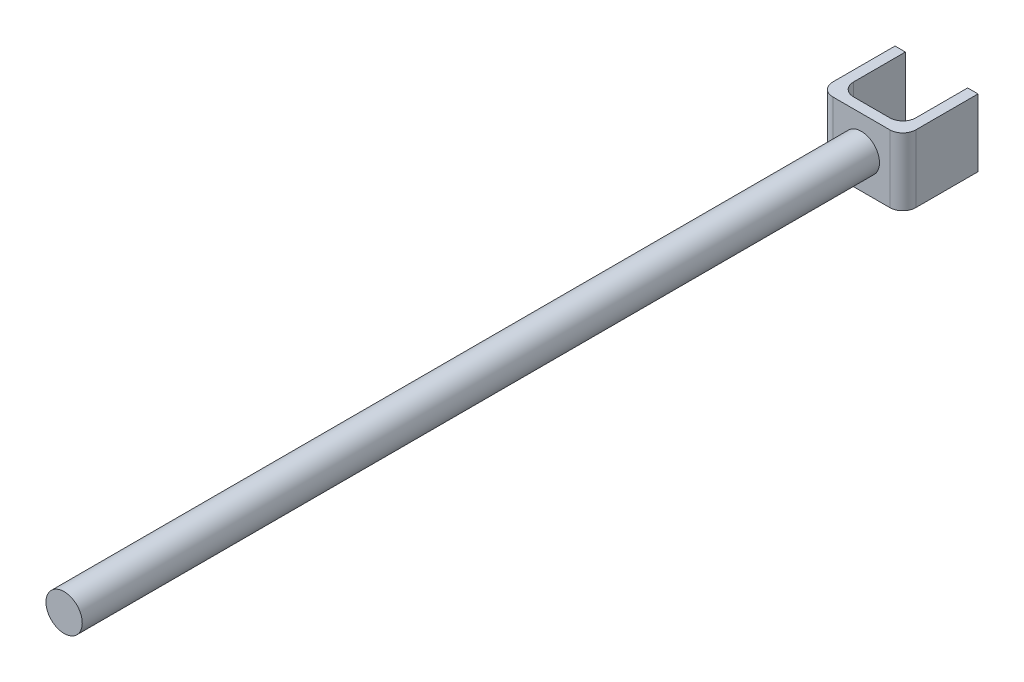
ISO-10303-21;
HEADER;
FILE_DESCRIPTION(('STEP AP214'),'2;1');
FILE_NAME('part.step','',(''),(''),'','','');
FILE_SCHEMA(('AUTOMOTIVE_DESIGN { 1 0 10303 214 1 1 1 1 }'));
ENDSEC;
DATA;
#1=APPLICATION_CONTEXT('core data for automotive mechanical design processes');
#2=APPLICATION_PROTOCOL_DEFINITION('international standard','automotive_design',2000,#1);
#3=PRODUCT_CONTEXT('',#1,'mechanical');
#4=PRODUCT('Part','Part','',(#3));
#5=PRODUCT_RELATED_PRODUCT_CATEGORY('part','',(#4));
#6=PRODUCT_DEFINITION_FORMATION('','',#4);
#7=PRODUCT_DEFINITION_CONTEXT('part definition',#1,'design');
#8=PRODUCT_DEFINITION('design','',#6,#7);
#9=PRODUCT_DEFINITION_SHAPE('','',#8);
#10=(LENGTH_UNIT() NAMED_UNIT(*) SI_UNIT(.MILLI.,.METRE.));
#11=(NAMED_UNIT(*) PLANE_ANGLE_UNIT() SI_UNIT($,.RADIAN.));
#12=(NAMED_UNIT(*) SI_UNIT($,.STERADIAN.) SOLID_ANGLE_UNIT());
#13=UNCERTAINTY_MEASURE_WITH_UNIT(LENGTH_MEASURE(1.E-05),#10,'distance_accuracy_value','');
#14=(GEOMETRIC_REPRESENTATION_CONTEXT(3) GLOBAL_UNCERTAINTY_ASSIGNED_CONTEXT((#13)) GLOBAL_UNIT_ASSIGNED_CONTEXT((#10,
#11,#12)) REPRESENTATION_CONTEXT('',''));
#15=CARTESIAN_POINT('',(0.,0.,0.));
#16=DIRECTION('',(0.,0.,1.));
#17=DIRECTION('',(1.,0.,0.));
#18=AXIS2_PLACEMENT_3D('',#15,#16,#17);
#19=CARTESIAN_POINT('',(11.,-13.,19.7762569570526));
#20=DIRECTION('',(0.,1.,0.));
#21=DIRECTION('',(0.,0.,1.));
#22=AXIS2_PLACEMENT_3D('',#19,#20,#21);
#23=CYLINDRICAL_SURFACE('',#22,5.);
#24=DIRECTION('',(0.,1.,0.));
#25=VECTOR('',#24,1.);
#26=CARTESIAN_POINT('',(16.,-13.,19.7762569570526));
#27=LINE('',#26,#25);
#28=CARTESIAN_POINT('',(16.,-13.,19.7762569570526));
#29=VERTEX_POINT('',#28);
#30=CARTESIAN_POINT('',(16.,13.,19.7762569570526));
#31=VERTEX_POINT('',#30);
#32=EDGE_CURVE('E44',#29,#31,#27,.T.);
#33=ORIENTED_EDGE('',*,*,#32,.T.);
#34=CARTESIAN_POINT('',(11.,13.,19.7762569570526));
#35=DIRECTION('',(0.,1.,0.));
#36=DIRECTION('',(0.,0.,-1.));
#37=AXIS2_PLACEMENT_3D('',#34,#35,#36);
#38=CIRCLE('',#37,5.);
#39=CARTESIAN_POINT('',(11.,13.,24.7762569570526));
#40=VERTEX_POINT('',#39);
#41=EDGE_CURVE('E129',#40,#31,#38,.T.);
#42=ORIENTED_EDGE('',*,*,#41,.F.);
#43=DIRECTION('',(0.,1.,0.));
#44=VECTOR('',#43,1.);
#45=CARTESIAN_POINT('',(11.,-13.,24.7762569570526));
#46=LINE('',#45,#44);
#47=CARTESIAN_POINT('',(11.,-13.,24.7762569570526));
#48=VERTEX_POINT('',#47);
#49=EDGE_CURVE('E11',#48,#40,#46,.T.);
#50=ORIENTED_EDGE('',*,*,#49,.F.);
#51=CARTESIAN_POINT('',(11.,-13.,19.7762569570526));
#52=DIRECTION('',(0.,1.,0.));
#53=DIRECTION('',(0.,0.,-1.));
#54=AXIS2_PLACEMENT_3D('',#51,#52,#53);
#55=CIRCLE('',#54,5.);
#56=EDGE_CURVE('E130',#48,#29,#55,.T.);
#57=ORIENTED_EDGE('',*,*,#56,.T.);
#58=EDGE_LOOP('',(#33,#42,#50,#57));
#59=FACE_BOUND('',#58,.T.);
#60=ADVANCED_FACE('F41',(#59),#23,.T.);
#61=CARTESIAN_POINT('',(11.,-13.,24.7762569570526));
#62=DIRECTION('',(0.,0.,1.));
#63=DIRECTION('',(1.,0.,0.));
#64=AXIS2_PLACEMENT_3D('',#61,#62,#63);
#65=PLANE('',#64);
#66=CARTESIAN_POINT('',(0.,0.,24.7762569570526));
#67=DIRECTION('',(0.,0.,1.));
#68=DIRECTION('',(1.,0.,0.));
#69=AXIS2_PLACEMENT_3D('',#66,#67,#68);
#70=CIRCLE('',#69,7.);
#71=CARTESIAN_POINT('',(7.,0.,24.7762569570526));
#72=VERTEX_POINT('',#71);
#73=EDGE_CURVE('E151',#72,#72,#70,.T.);
#74=ORIENTED_EDGE('',*,*,#73,.F.);
#75=EDGE_LOOP('',(#74));
#76=FACE_BOUND('',#75,.T.);
#77=ORIENTED_EDGE('',*,*,#49,.T.);
#78=DIRECTION('',(1.,0.,0.));
#79=VECTOR('',#78,1.);
#80=CARTESIAN_POINT('',(11.,13.,24.7762569570526));
#81=LINE('',#80,#79);
#82=CARTESIAN_POINT('',(-11.,13.,24.7762569570526));
#83=VERTEX_POINT('',#82);
#84=EDGE_CURVE('E147',#83,#40,#81,.T.);
#85=ORIENTED_EDGE('',*,*,#84,.F.);
#86=DIRECTION('',(0.,1.,0.));
#87=VECTOR('',#86,1.);
#88=CARTESIAN_POINT('',(-11.,-13.,24.7762569570526));
#89=LINE('',#88,#87);
#90=CARTESIAN_POINT('',(-11.,-13.,24.7762569570526));
#91=VERTEX_POINT('',#90);
#92=EDGE_CURVE('E49',#91,#83,#89,.T.);
#93=ORIENTED_EDGE('',*,*,#92,.F.);
#94=DIRECTION('',(1.,0.,0.));
#95=VECTOR('',#94,1.);
#96=CARTESIAN_POINT('',(11.,-13.,24.7762569570526));
#97=LINE('',#96,#95);
#98=EDGE_CURVE('E135',#91,#48,#97,.T.);
#99=ORIENTED_EDGE('',*,*,#98,.T.);
#100=EDGE_LOOP('',(#77,#85,#93,#99));
#101=FACE_BOUND('',#100,.T.);
#102=ADVANCED_FACE('F264',(#76,#101),#65,.T.);
#103=CARTESIAN_POINT('',(-11.,-13.,19.7762569570526));
#104=DIRECTION('',(0.,1.,0.));
#105=DIRECTION('',(0.,0.,1.));
#106=AXIS2_PLACEMENT_3D('',#103,#104,#105);
#107=CYLINDRICAL_SURFACE('',#106,5.);
#108=ORIENTED_EDGE('',*,*,#92,.T.);
#109=CARTESIAN_POINT('',(-11.,13.,19.7762569570526));
#110=DIRECTION('',(0.,1.,0.));
#111=DIRECTION('',(0.,0.,1.));
#112=AXIS2_PLACEMENT_3D('',#109,#110,#111);
#113=CIRCLE('',#112,5.);
#114=CARTESIAN_POINT('',(-16.,13.,19.7762569570526));
#115=VERTEX_POINT('',#114);
#116=EDGE_CURVE('E177',#115,#83,#113,.T.);
#117=ORIENTED_EDGE('',*,*,#116,.F.);
#118=DIRECTION('',(0.,1.,0.));
#119=VECTOR('',#118,1.);
#120=CARTESIAN_POINT('',(-16.,-13.,19.7762569570526));
#121=LINE('',#120,#119);
#122=CARTESIAN_POINT('',(-16.,-13.,19.7762569570526));
#123=VERTEX_POINT('',#122);
#124=EDGE_CURVE('E211',#123,#115,#121,.T.);
#125=ORIENTED_EDGE('',*,*,#124,.F.);
#126=CARTESIAN_POINT('',(-11.,-13.,19.7762569570526));
#127=DIRECTION('',(0.,1.,0.));
#128=DIRECTION('',(0.,0.,1.));
#129=AXIS2_PLACEMENT_3D('',#126,#127,#128);
#130=CIRCLE('',#129,5.);
#131=EDGE_CURVE('E207',#123,#91,#130,.T.);
#132=ORIENTED_EDGE('',*,*,#131,.T.);
#133=EDGE_LOOP('',(#108,#117,#125,#132));
#134=FACE_BOUND('',#133,.T.);
#135=ADVANCED_FACE('F262',(#134),#107,.T.);
#136=CARTESIAN_POINT('',(-16.,-13.,-4.2237430429474));
#137=DIRECTION('',(-1.,0.,0.));
#138=DIRECTION('',(0.,0.,1.));
#139=AXIS2_PLACEMENT_3D('',#136,#137,#138);
#140=PLANE('',#139);
#141=ORIENTED_EDGE('',*,*,#124,.T.);
#142=DIRECTION('',(0.,0.,1.));
#143=VECTOR('',#142,1.);
#144=CARTESIAN_POINT('',(-16.,13.,-4.2237430429474));
#145=LINE('',#144,#143);
#146=CARTESIAN_POINT('',(-16.,13.,-4.2237430429474));
#147=VERTEX_POINT('',#146);
#148=EDGE_CURVE('E174',#147,#115,#145,.T.);
#149=ORIENTED_EDGE('',*,*,#148,.F.);
#150=DIRECTION('',(0.,1.,0.));
#151=VECTOR('',#150,1.);
#152=CARTESIAN_POINT('',(-16.,-13.,-4.2237430429474));
#153=LINE('',#152,#151);
#154=CARTESIAN_POINT('',(-16.,-13.,-4.2237430429474));
#155=VERTEX_POINT('',#154);
#156=EDGE_CURVE('E213',#155,#147,#153,.T.);
#157=ORIENTED_EDGE('',*,*,#156,.F.);
#158=DIRECTION('',(0.,0.,1.));
#159=VECTOR('',#158,1.);
#160=CARTESIAN_POINT('',(-16.,-13.,-4.2237430429474));
#161=LINE('',#160,#159);
#162=EDGE_CURVE('E204',#155,#123,#161,.T.);
#163=ORIENTED_EDGE('',*,*,#162,.T.);
#164=EDGE_LOOP('',(#141,#149,#157,#163));
#165=FACE_BOUND('',#164,.T.);
#166=ADVANCED_FACE('F260',(#165),#140,.T.);
#167=CARTESIAN_POINT('',(-12.,-13.,-4.2237430429474));
#168=DIRECTION('',(0.,0.,-1.));
#169=DIRECTION('',(-1.,0.,0.));
#170=AXIS2_PLACEMENT_3D('',#167,#168,#169);
#171=PLANE('',#170);
#172=ORIENTED_EDGE('',*,*,#156,.T.);
#173=DIRECTION('',(-1.,0.,0.));
#174=VECTOR('',#173,1.);
#175=CARTESIAN_POINT('',(-12.,13.,-4.2237430429474));
#176=LINE('',#175,#174);
#177=CARTESIAN_POINT('',(-12.,13.,-4.2237430429474));
#178=VERTEX_POINT('',#177);
#179=EDGE_CURVE('E171',#178,#147,#176,.T.);
#180=ORIENTED_EDGE('',*,*,#179,.F.);
#181=DIRECTION('',(0.,1.,0.));
#182=VECTOR('',#181,1.);
#183=CARTESIAN_POINT('',(-12.,-13.,-4.2237430429474));
#184=LINE('',#183,#182);
#185=CARTESIAN_POINT('',(-12.,-13.,-4.2237430429474));
#186=VERTEX_POINT('',#185);
#187=EDGE_CURVE('E215',#186,#178,#184,.T.);
#188=ORIENTED_EDGE('',*,*,#187,.F.);
#189=DIRECTION('',(-1.,0.,0.));
#190=VECTOR('',#189,1.);
#191=CARTESIAN_POINT('',(-12.,-13.,-4.2237430429474));
#192=LINE('',#191,#190);
#193=EDGE_CURVE('E201',#186,#155,#192,.T.);
#194=ORIENTED_EDGE('',*,*,#193,.T.);
#195=EDGE_LOOP('',(#172,#180,#188,#194));
#196=FACE_BOUND('',#195,.T.);
#197=ADVANCED_FACE('F255',(#196),#171,.T.);
#198=CARTESIAN_POINT('',(-12.,-13.,15.7762569570526));
#199=DIRECTION('',(1.,0.,0.));
#200=DIRECTION('',(0.,0.,-1.));
#201=AXIS2_PLACEMENT_3D('',#198,#199,#200);
#202=PLANE('',#201);
#203=ORIENTED_EDGE('',*,*,#187,.T.);
#204=DIRECTION('',(0.,0.,-1.));
#205=VECTOR('',#204,1.);
#206=CARTESIAN_POINT('',(-12.,13.,15.7762569570526));
#207=LINE('',#206,#205);
#208=CARTESIAN_POINT('',(-12.,13.,15.7762569570526));
#209=VERTEX_POINT('',#208);
#210=EDGE_CURVE('E168',#209,#178,#207,.T.);
#211=ORIENTED_EDGE('',*,*,#210,.F.);
#212=DIRECTION('',(0.,1.,0.));
#213=VECTOR('',#212,1.);
#214=CARTESIAN_POINT('',(-12.,-13.,15.7762569570526));
#215=LINE('',#214,#213);
#216=CARTESIAN_POINT('',(-12.,-13.,15.7762569570526));
#217=VERTEX_POINT('',#216);
#218=EDGE_CURVE('E217',#217,#209,#215,.T.);
#219=ORIENTED_EDGE('',*,*,#218,.F.);
#220=DIRECTION('',(0.,0.,-1.));
#221=VECTOR('',#220,1.);
#222=CARTESIAN_POINT('',(-12.,-13.,15.7762569570526));
#223=LINE('',#222,#221);
#224=EDGE_CURVE('E198',#217,#186,#223,.T.);
#225=ORIENTED_EDGE('',*,*,#224,.T.);
#226=EDGE_LOOP('',(#203,#211,#219,#225));
#227=FACE_BOUND('',#226,.T.);
#228=ADVANCED_FACE('F250',(#227),#202,.T.);
#229=CARTESIAN_POINT('',(-7.,-13.,15.7762569570526));
#230=DIRECTION('',(0.,1.,0.));
#231=DIRECTION('',(0.,0.,1.));
#232=AXIS2_PLACEMENT_3D('',#229,#230,#231);
#233=CYLINDRICAL_SURFACE('',#232,5.);
#234=ORIENTED_EDGE('',*,*,#218,.T.);
#235=CARTESIAN_POINT('',(-7.,13.,15.7762569570526));
#236=DIRECTION('',(0.,-1.,0.));
#237=DIRECTION('',(0.,0.,-1.));
#238=AXIS2_PLACEMENT_3D('',#235,#236,#237);
#239=CIRCLE('',#238,5.);
#240=CARTESIAN_POINT('',(-6.99999999999997,13.,20.7762569570526));
#241=VERTEX_POINT('',#240);
#242=EDGE_CURVE('E165',#241,#209,#239,.T.);
#243=ORIENTED_EDGE('',*,*,#242,.F.);
#244=DIRECTION('',(0.,1.,0.));
#245=VECTOR('',#244,1.);
#246=CARTESIAN_POINT('',(-6.99999999999997,-13.,20.7762569570526));
#247=LINE('',#246,#245);
#248=CARTESIAN_POINT('',(-6.99999999999997,-13.,20.7762569570526));
#249=VERTEX_POINT('',#248);
#250=EDGE_CURVE('E219',#249,#241,#247,.T.);
#251=ORIENTED_EDGE('',*,*,#250,.F.);
#252=CARTESIAN_POINT('',(-7.,-13.,15.7762569570526));
#253=DIRECTION('',(0.,-1.,0.));
#254=DIRECTION('',(0.,0.,-1.));
#255=AXIS2_PLACEMENT_3D('',#252,#253,#254);
#256=CIRCLE('',#255,5.);
#257=EDGE_CURVE('E195',#249,#217,#256,.T.);
#258=ORIENTED_EDGE('',*,*,#257,.T.);
#259=EDGE_LOOP('',(#234,#243,#251,#258));
#260=FACE_BOUND('',#259,.T.);
#261=ADVANCED_FACE('F248',(#260),#233,.F.);
#262=CARTESIAN_POINT('',(6.99999999999997,-13.,20.7762569570526));
#263=DIRECTION('',(0.,0.,-1.));
#264=DIRECTION('',(-1.,0.,0.));
#265=AXIS2_PLACEMENT_3D('',#262,#263,#264);
#266=PLANE('',#265);
#267=ORIENTED_EDGE('',*,*,#250,.T.);
#268=DIRECTION('',(-1.,0.,0.));
#269=VECTOR('',#268,1.);
#270=CARTESIAN_POINT('',(6.99999999999997,13.,20.7762569570526));
#271=LINE('',#270,#269);
#272=CARTESIAN_POINT('',(6.99999999999997,13.,20.7762569570526));
#273=VERTEX_POINT('',#272);
#274=EDGE_CURVE('E162',#273,#241,#271,.T.);
#275=ORIENTED_EDGE('',*,*,#274,.F.);
#276=DIRECTION('',(0.,1.,0.));
#277=VECTOR('',#276,1.);
#278=CARTESIAN_POINT('',(6.99999999999997,-13.,20.7762569570526));
#279=LINE('',#278,#277);
#280=CARTESIAN_POINT('',(6.99999999999997,-13.,20.7762569570526));
#281=VERTEX_POINT('',#280);
#282=EDGE_CURVE('E221',#281,#273,#279,.T.);
#283=ORIENTED_EDGE('',*,*,#282,.F.);
#284=DIRECTION('',(-1.,0.,0.));
#285=VECTOR('',#284,1.);
#286=CARTESIAN_POINT('',(6.99999999999997,-13.,20.7762569570526));
#287=LINE('',#286,#285);
#288=EDGE_CURVE('E192',#281,#249,#287,.T.);
#289=ORIENTED_EDGE('',*,*,#288,.T.);
#290=EDGE_LOOP('',(#267,#275,#283,#289));
#291=FACE_BOUND('',#290,.T.);
#292=ADVANCED_FACE('F243',(#291),#266,.T.);
#293=CARTESIAN_POINT('',(7.,-13.,15.7762569570526));
#294=DIRECTION('',(0.,1.,0.));
#295=DIRECTION('',(0.,0.,1.));
#296=AXIS2_PLACEMENT_3D('',#293,#294,#295);
#297=CYLINDRICAL_SURFACE('',#296,5.);
#298=ORIENTED_EDGE('',*,*,#282,.T.);
#299=CARTESIAN_POINT('',(7.,13.,15.7762569570526));
#300=DIRECTION('',(0.,-1.,0.));
#301=DIRECTION('',(0.,0.,1.));
#302=AXIS2_PLACEMENT_3D('',#299,#300,#301);
#303=CIRCLE('',#302,5.);
#304=CARTESIAN_POINT('',(12.,13.,15.7762569570526));
#305=VERTEX_POINT('',#304);
#306=EDGE_CURVE('E159',#305,#273,#303,.T.);
#307=ORIENTED_EDGE('',*,*,#306,.F.);
#308=DIRECTION('',(0.,1.,0.));
#309=VECTOR('',#308,1.);
#310=CARTESIAN_POINT('',(12.,-13.,15.7762569570526));
#311=LINE('',#310,#309);
#312=CARTESIAN_POINT('',(12.,-13.,15.7762569570526));
#313=VERTEX_POINT('',#312);
#314=EDGE_CURVE('E223',#313,#305,#311,.T.);
#315=ORIENTED_EDGE('',*,*,#314,.F.);
#316=CARTESIAN_POINT('',(7.,-13.,15.7762569570526));
#317=DIRECTION('',(0.,-1.,0.));
#318=DIRECTION('',(0.,0.,1.));
#319=AXIS2_PLACEMENT_3D('',#316,#317,#318);
#320=CIRCLE('',#319,5.);
#321=EDGE_CURVE('E189',#313,#281,#320,.T.);
#322=ORIENTED_EDGE('',*,*,#321,.T.);
#323=EDGE_LOOP('',(#298,#307,#315,#322));
#324=FACE_BOUND('',#323,.T.);
#325=ADVANCED_FACE('F236',(#324),#297,.F.);
#326=CARTESIAN_POINT('',(12.,-13.,15.7762569570526));
#327=DIRECTION('',(-1.,0.,0.));
#328=DIRECTION('',(0.,0.,1.));
#329=AXIS2_PLACEMENT_3D('',#326,#327,#328);
#330=PLANE('',#329);
#331=ORIENTED_EDGE('',*,*,#314,.T.);
#332=DIRECTION('',(0.,0.,1.));
#333=VECTOR('',#332,1.);
#334=CARTESIAN_POINT('',(12.,13.,15.7762569570526));
#335=LINE('',#334,#333);
#336=CARTESIAN_POINT('',(12.,13.,-4.2237430429474));
#337=VERTEX_POINT('',#336);
#338=EDGE_CURVE('E156',#337,#305,#335,.T.);
#339=ORIENTED_EDGE('',*,*,#338,.F.);
#340=DIRECTION('',(0.,1.,0.));
#341=VECTOR('',#340,1.);
#342=CARTESIAN_POINT('',(12.,-13.,-4.2237430429474));
#343=LINE('',#342,#341);
#344=CARTESIAN_POINT('',(12.,-13.,-4.2237430429474));
#345=VERTEX_POINT('',#344);
#346=EDGE_CURVE('E225',#345,#337,#343,.T.);
#347=ORIENTED_EDGE('',*,*,#346,.F.);
#348=DIRECTION('',(0.,0.,1.));
#349=VECTOR('',#348,1.);
#350=CARTESIAN_POINT('',(12.,-13.,15.7762569570526));
#351=LINE('',#350,#349);
#352=EDGE_CURVE('E186',#345,#313,#351,.T.);
#353=ORIENTED_EDGE('',*,*,#352,.T.);
#354=EDGE_LOOP('',(#331,#339,#347,#353));
#355=FACE_BOUND('',#354,.T.);
#356=ADVANCED_FACE('F233',(#355),#330,.T.);
#357=CARTESIAN_POINT('',(12.,-13.,-4.2237430429474));
#358=DIRECTION('',(0.,0.,-1.));
#359=DIRECTION('',(-1.,0.,0.));
#360=AXIS2_PLACEMENT_3D('',#357,#358,#359);
#361=PLANE('',#360);
#362=ORIENTED_EDGE('',*,*,#346,.T.);
#363=DIRECTION('',(-1.,0.,0.));
#364=VECTOR('',#363,1.);
#365=CARTESIAN_POINT('',(12.,13.,-4.2237430429474));
#366=LINE('',#365,#364);
#367=CARTESIAN_POINT('',(16.,13.,-4.2237430429474));
#368=VERTEX_POINT('',#367);
#369=EDGE_CURVE('E142',#368,#337,#366,.T.);
#370=ORIENTED_EDGE('',*,*,#369,.F.);
#371=DIRECTION('',(0.,1.,0.));
#372=VECTOR('',#371,1.);
#373=CARTESIAN_POINT('',(16.,-13.,-4.2237430429474));
#374=LINE('',#373,#372);
#375=CARTESIAN_POINT('',(16.,-13.,-4.2237430429474));
#376=VERTEX_POINT('',#375);
#377=EDGE_CURVE('E134',#376,#368,#374,.T.);
#378=ORIENTED_EDGE('',*,*,#377,.F.);
#379=DIRECTION('',(-1.,0.,0.));
#380=VECTOR('',#379,1.);
#381=CARTESIAN_POINT('',(12.,-13.,-4.2237430429474));
#382=LINE('',#381,#380);
#383=EDGE_CURVE('E183',#376,#345,#382,.T.);
#384=ORIENTED_EDGE('',*,*,#383,.T.);
#385=EDGE_LOOP('',(#362,#370,#378,#384));
#386=FACE_BOUND('',#385,.T.);
#387=ADVANCED_FACE('F227',(#386),#361,.T.);
#388=CARTESIAN_POINT('',(16.,-13.,-4.2237430429474));
#389=DIRECTION('',(1.,0.,0.));
#390=DIRECTION('',(0.,0.,-1.));
#391=AXIS2_PLACEMENT_3D('',#388,#389,#390);
#392=PLANE('',#391);
#393=ORIENTED_EDGE('',*,*,#377,.T.);
#394=DIRECTION('',(0.,0.,-1.));
#395=VECTOR('',#394,1.);
#396=CARTESIAN_POINT('',(16.,13.,-4.2237430429474));
#397=LINE('',#396,#395);
#398=EDGE_CURVE('E137',#31,#368,#397,.T.);
#399=ORIENTED_EDGE('',*,*,#398,.F.);
#400=ORIENTED_EDGE('',*,*,#32,.F.);
#401=DIRECTION('',(0.,0.,-1.));
#402=VECTOR('',#401,1.);
#403=CARTESIAN_POINT('',(16.,-13.,-4.2237430429474));
#404=LINE('',#403,#402);
#405=EDGE_CURVE('E181',#29,#376,#404,.T.);
#406=ORIENTED_EDGE('',*,*,#405,.T.);
#407=EDGE_LOOP('',(#393,#399,#400,#406));
#408=FACE_BOUND('',#407,.T.);
#409=ADVANCED_FACE('F138',(#408),#392,.T.);
#410=CARTESIAN_POINT('',(11.,-13.,19.7762569570526));
#411=DIRECTION('',(0.,-1.,0.));
#412=DIRECTION('',(0.,0.,-1.));
#413=AXIS2_PLACEMENT_3D('',#410,#411,#412);
#414=PLANE('',#413);
#415=ORIENTED_EDGE('',*,*,#56,.F.);
#416=ORIENTED_EDGE('',*,*,#98,.F.);
#417=ORIENTED_EDGE('',*,*,#131,.F.);
#418=ORIENTED_EDGE('',*,*,#162,.F.);
#419=ORIENTED_EDGE('',*,*,#193,.F.);
#420=ORIENTED_EDGE('',*,*,#224,.F.);
#421=ORIENTED_EDGE('',*,*,#257,.F.);
#422=ORIENTED_EDGE('',*,*,#288,.F.);
#423=ORIENTED_EDGE('',*,*,#321,.F.);
#424=ORIENTED_EDGE('',*,*,#352,.F.);
#425=ORIENTED_EDGE('',*,*,#383,.F.);
#426=ORIENTED_EDGE('',*,*,#405,.F.);
#427=EDGE_LOOP('',(#415,#416,#417,#418,#419,#420,#421,#422,#423,#424,#425,#426));
#428=FACE_BOUND('',#427,.T.);
#429=ADVANCED_FACE('F239',(#428),#414,.T.);
#430=CARTESIAN_POINT('',(11.,13.,19.7762569570526));
#431=DIRECTION('',(0.,-1.,0.));
#432=DIRECTION('',(0.,0.,-1.));
#433=AXIS2_PLACEMENT_3D('',#430,#431,#432);
#434=PLANE('',#433);
#435=ORIENTED_EDGE('',*,*,#41,.T.);
#436=ORIENTED_EDGE('',*,*,#398,.T.);
#437=ORIENTED_EDGE('',*,*,#369,.T.);
#438=ORIENTED_EDGE('',*,*,#338,.T.);
#439=ORIENTED_EDGE('',*,*,#306,.T.);
#440=ORIENTED_EDGE('',*,*,#274,.T.);
#441=ORIENTED_EDGE('',*,*,#242,.T.);
#442=ORIENTED_EDGE('',*,*,#210,.T.);
#443=ORIENTED_EDGE('',*,*,#179,.T.);
#444=ORIENTED_EDGE('',*,*,#148,.T.);
#445=ORIENTED_EDGE('',*,*,#116,.T.);
#446=ORIENTED_EDGE('',*,*,#84,.T.);
#447=EDGE_LOOP('',(#435,#436,#437,#438,#439,#440,#441,#442,#443,#444,#445,#446));
#448=FACE_BOUND('',#447,.T.);
#449=ADVANCED_FACE('F145',(#448),#434,.F.);
#450=CARTESIAN_POINT('',(0.,0.,332.276256957053));
#451=DIRECTION('',(0.,0.,-1.));
#452=DIRECTION('',(-1.,0.,0.));
#453=AXIS2_PLACEMENT_3D('',#450,#451,#452);
#454=CYLINDRICAL_SURFACE('',#453,7.);
#455=CARTESIAN_POINT('',(0.,0.,332.276256957053));
#456=DIRECTION('',(0.,0.,1.));
#457=DIRECTION('',(1.,0.,0.));
#458=AXIS2_PLACEMENT_3D('',#455,#456,#457);
#459=CIRCLE('',#458,7.);
#460=CARTESIAN_POINT('',(7.,0.,332.276256957053));
#461=VERTEX_POINT('',#460);
#462=EDGE_CURVE('E148',#461,#461,#459,.T.);
#463=ORIENTED_EDGE('',*,*,#462,.F.);
#464=EDGE_LOOP('',(#463));
#465=FACE_BOUND('',#464,.T.);
#466=ORIENTED_EDGE('',*,*,#73,.T.);
#467=EDGE_LOOP('',(#466));
#468=FACE_BOUND('',#467,.T.);
#469=ADVANCED_FACE('F299',(#465,#468),#454,.T.);
#470=CARTESIAN_POINT('',(0.,0.,332.276256957053));
#471=DIRECTION('',(0.,0.,1.));
#472=DIRECTION('',(1.,0.,0.));
#473=AXIS2_PLACEMENT_3D('',#470,#471,#472);
#474=PLANE('',#473);
#475=ORIENTED_EDGE('',*,*,#462,.T.);
#476=EDGE_LOOP('',(#475));
#477=FACE_BOUND('',#476,.T.);
#478=ADVANCED_FACE('F303',(#477),#474,.T.);
#479=CLOSED_SHELL('',(#60,#102,#135,#166,#197,#228,#261,#292,#325,#356,#387,#409,#429,#449,#469,#478));
#480=MANIFOLD_SOLID_BREP('B2',#479);
#481=ADVANCED_BREP_SHAPE_REPRESENTATION('',(#18,#480),#14);
#482=SHAPE_DEFINITION_REPRESENTATION(#9,#481);
ENDSEC;
END-ISO-10303-21;
